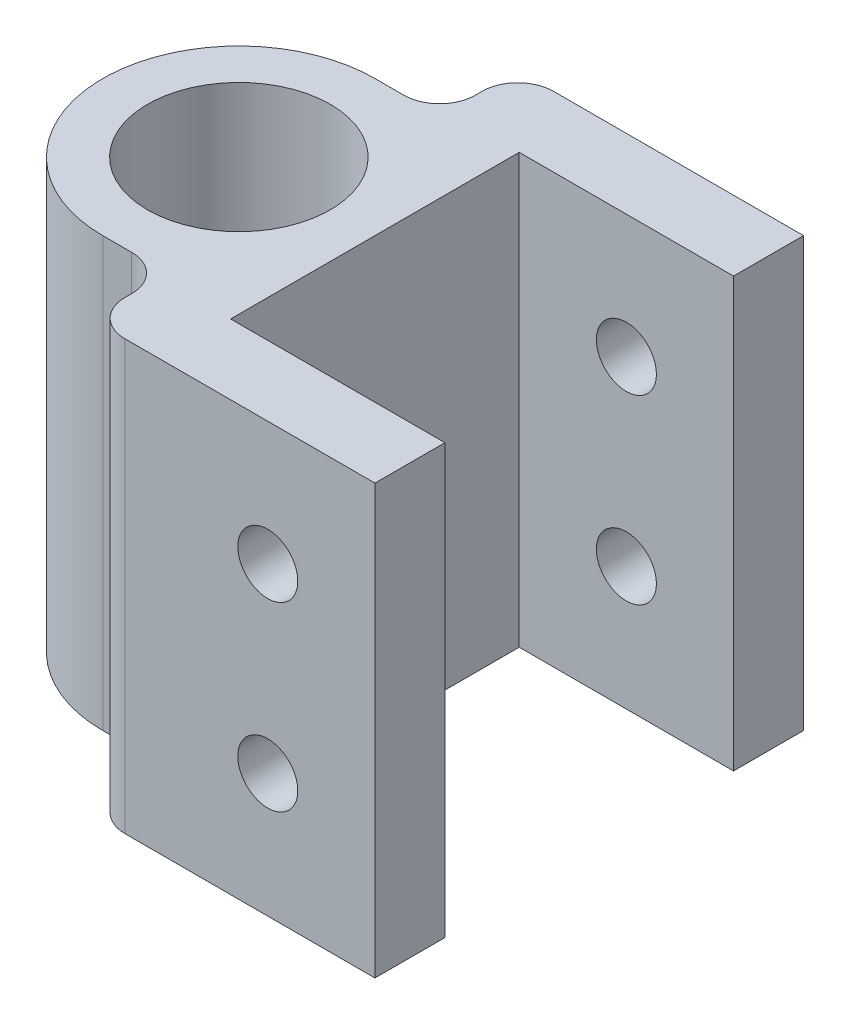
ISO-10303-21;
HEADER;
FILE_DESCRIPTION(('STEP AP214'),'2;1');
FILE_NAME('part.step','',(''),(''),'','','');
FILE_SCHEMA(('AUTOMOTIVE_DESIGN { 1 0 10303 214 1 1 1 1 }'));
ENDSEC;
DATA;
#1=APPLICATION_CONTEXT('core data for automotive mechanical design processes');
#2=APPLICATION_PROTOCOL_DEFINITION('international standard','automotive_design',2000,#1);
#3=PRODUCT_CONTEXT('',#1,'mechanical');
#4=PRODUCT('Part','Part','',(#3));
#5=PRODUCT_RELATED_PRODUCT_CATEGORY('part','',(#4));
#6=PRODUCT_DEFINITION_FORMATION('','',#4);
#7=PRODUCT_DEFINITION_CONTEXT('part definition',#1,'design');
#8=PRODUCT_DEFINITION('design','',#6,#7);
#9=PRODUCT_DEFINITION_SHAPE('','',#8);
#10=(LENGTH_UNIT() NAMED_UNIT(*) SI_UNIT(.MILLI.,.METRE.));
#11=(NAMED_UNIT(*) PLANE_ANGLE_UNIT() SI_UNIT($,.RADIAN.));
#12=(NAMED_UNIT(*) SI_UNIT($,.STERADIAN.) SOLID_ANGLE_UNIT());
#13=UNCERTAINTY_MEASURE_WITH_UNIT(LENGTH_MEASURE(1.E-05),#10,'distance_accuracy_value','');
#14=(GEOMETRIC_REPRESENTATION_CONTEXT(3) GLOBAL_UNCERTAINTY_ASSIGNED_CONTEXT((#13)) GLOBAL_UNIT_ASSIGNED_CONTEXT((#10,
#11,#12)) REPRESENTATION_CONTEXT('',''));
#15=CARTESIAN_POINT('',(0.,0.,0.));
#16=DIRECTION('',(0.,0.,1.));
#17=DIRECTION('',(1.,0.,0.));
#18=AXIS2_PLACEMENT_3D('',#15,#16,#17);
#19=CARTESIAN_POINT('',(0.,30.,0.));
#20=DIRECTION('',(0.,1.,0.));
#21=DIRECTION('',(0.,0.,1.));
#22=AXIS2_PLACEMENT_3D('',#19,#20,#21);
#23=PLANE('',#22);
#24=CARTESIAN_POINT('',(-14.712969924812,30.,-1.80451127819549));
#25=DIRECTION('',(0.,1.,0.));
#26=DIRECTION('',(0.,0.,1.));
#27=AXIS2_PLACEMENT_3D('',#24,#25,#26);
#28=CIRCLE('',#27,6.4);
#29=CARTESIAN_POINT('',(-14.712969924812,30.,4.59548872180451));
#30=VERTEX_POINT('',#29);
#31=EDGE_CURVE('E185',#30,#30,#28,.T.);
#32=ORIENTED_EDGE('',*,*,#31,.F.);
#33=EDGE_LOOP('',(#32));
#34=FACE_BOUND('',#33,.T.);
#35=DIRECTION('',(0.,0.,1.));
#36=VECTOR('',#35,1.);
#37=CARTESIAN_POINT('',(-10.187969924812,30.,0.));
#38=LINE('',#37,#36);
#39=CARTESIAN_POINT('',(-10.187969924812,30.,10.2204887218045));
#40=VERTEX_POINT('',#39);
#41=CARTESIAN_POINT('',(-10.187969924812,30.,10.6954887218045));
#42=VERTEX_POINT('',#41);
#43=EDGE_CURVE('E203',#40,#42,#38,.T.);
#44=ORIENTED_EDGE('',*,*,#43,.T.);
#45=CARTESIAN_POINT('',(-7.68796992481203,30.,10.6954887218045));
#46=DIRECTION('',(0.,1.,0.));
#47=DIRECTION('',(0.,0.,1.));
#48=AXIS2_PLACEMENT_3D('',#45,#46,#47);
#49=CIRCLE('',#48,2.5);
#50=CARTESIAN_POINT('',(-7.68796992481203,30.,13.1954887218045));
#51=VERTEX_POINT('',#50);
#52=EDGE_CURVE('E268',#42,#51,#49,.T.);
#53=ORIENTED_EDGE('',*,*,#52,.T.);
#54=DIRECTION('',(1.,0.,0.));
#55=VECTOR('',#54,1.);
#56=CARTESIAN_POINT('',(0.,30.,13.1954887218045));
#57=LINE('',#56,#55);
#58=CARTESIAN_POINT('',(9.81203007518797,30.,13.1954887218045));
#59=VERTEX_POINT('',#58);
#60=EDGE_CURVE('E206',#51,#59,#57,.T.);
#61=ORIENTED_EDGE('',*,*,#60,.T.);
#62=DIRECTION('',(0.,0.,-1.));
#63=VECTOR('',#62,1.);
#64=CARTESIAN_POINT('',(9.81203007518797,30.,0.));
#65=LINE('',#64,#63);
#66=CARTESIAN_POINT('',(9.81203007518797,30.,8.2954887218045));
#67=VERTEX_POINT('',#66);
#68=EDGE_CURVE('E208',#59,#67,#65,.T.);
#69=ORIENTED_EDGE('',*,*,#68,.T.);
#70=DIRECTION('',(1.,0.,0.));
#71=VECTOR('',#70,1.);
#72=CARTESIAN_POINT('',(0.,30.,8.2954887218045));
#73=LINE('',#72,#71);
#74=CARTESIAN_POINT('',(-5.18796992481203,30.,8.2954887218045));
#75=VERTEX_POINT('',#74);
#76=EDGE_CURVE('E210',#75,#67,#73,.T.);
#77=ORIENTED_EDGE('',*,*,#76,.F.);
#78=DIRECTION('',(0.,0.,1.));
#79=VECTOR('',#78,1.);
#80=CARTESIAN_POINT('',(-5.18796992481203,30.,0.));
#81=LINE('',#80,#79);
#82=CARTESIAN_POINT('',(-5.18796992481203,30.,-11.9045112781955));
#83=VERTEX_POINT('',#82);
#84=EDGE_CURVE('E213',#83,#75,#81,.T.);
#85=ORIENTED_EDGE('',*,*,#84,.F.);
#86=DIRECTION('',(1.,0.,0.));
#87=VECTOR('',#86,1.);
#88=CARTESIAN_POINT('',(0.,30.,-11.9045112781955));
#89=LINE('',#88,#87);
#90=CARTESIAN_POINT('',(9.81203007518797,30.,-11.9045112781955));
#91=VERTEX_POINT('',#90);
#92=EDGE_CURVE('E216',#83,#91,#89,.T.);
#93=ORIENTED_EDGE('',*,*,#92,.T.);
#94=DIRECTION('',(0.,0.,1.));
#95=VECTOR('',#94,1.);
#96=CARTESIAN_POINT('',(9.81203007518797,30.,0.));
#97=LINE('',#96,#95);
#98=CARTESIAN_POINT('',(9.81203007518797,30.,-16.8045112781955));
#99=VERTEX_POINT('',#98);
#100=EDGE_CURVE('E192',#99,#91,#97,.T.);
#101=ORIENTED_EDGE('',*,*,#100,.F.);
#102=DIRECTION('',(1.,0.,0.));
#103=VECTOR('',#102,1.);
#104=CARTESIAN_POINT('',(0.,30.,-16.8045112781955));
#105=LINE('',#104,#103);
#106=CARTESIAN_POINT('',(-7.68796992481203,30.,-16.8045112781955));
#107=VERTEX_POINT('',#106);
#108=EDGE_CURVE('E195',#107,#99,#105,.T.);
#109=ORIENTED_EDGE('',*,*,#108,.F.);
#110=CARTESIAN_POINT('',(-7.68796992481203,30.,-14.3045112781955));
#111=DIRECTION('',(0.,1.,0.));
#112=DIRECTION('',(0.,0.,1.));
#113=AXIS2_PLACEMENT_3D('',#110,#111,#112);
#114=CIRCLE('',#113,2.5);
#115=CARTESIAN_POINT('',(-10.187969924812,30.,-14.3045112781955));
#116=VERTEX_POINT('',#115);
#117=EDGE_CURVE('E266',#107,#116,#114,.T.);
#118=ORIENTED_EDGE('',*,*,#117,.T.);
#119=DIRECTION('',(0.,0.,1.));
#120=VECTOR('',#119,1.);
#121=CARTESIAN_POINT('',(-10.187969924812,30.,0.));
#122=LINE('',#121,#120);
#123=CARTESIAN_POINT('',(-10.187969924812,30.,-13.8295112781955));
#124=VERTEX_POINT('',#123);
#125=EDGE_CURVE('E198',#116,#124,#122,.T.);
#126=ORIENTED_EDGE('',*,*,#125,.T.);
#127=CARTESIAN_POINT('',(-12.687969924812,30.,-13.8295112781955));
#128=DIRECTION('',(0.,1.,0.));
#129=DIRECTION('',(0.,0.,1.));
#130=AXIS2_PLACEMENT_3D('',#127,#128,#129);
#131=CIRCLE('',#130,2.5);
#132=CARTESIAN_POINT('',(-12.687969924812,30.,-11.3295112781955));
#133=VERTEX_POINT('',#132);
#134=EDGE_CURVE('E11',#124,#133,#131,.F.);
#135=ORIENTED_EDGE('',*,*,#134,.T.);
#136=DIRECTION('',(-1.,0.,0.));
#137=VECTOR('',#136,1.);
#138=CARTESIAN_POINT('',(0.,30.,-11.3295112781955));
#139=LINE('',#138,#137);
#140=CARTESIAN_POINT('',(-14.712969924812,30.,-11.3295112781955));
#141=VERTEX_POINT('',#140);
#142=EDGE_CURVE('E200',#133,#141,#139,.T.);
#143=ORIENTED_EDGE('',*,*,#142,.T.);
#144=CARTESIAN_POINT('',(-14.712969924812,30.,-1.80451127819549));
#145=DIRECTION('',(0.,1.,0.));
#146=DIRECTION('',(0.,0.,1.));
#147=AXIS2_PLACEMENT_3D('',#144,#145,#146);
#148=CIRCLE('',#147,9.525);
#149=CARTESIAN_POINT('',(-14.712969924812,30.,7.72048872180451));
#150=VERTEX_POINT('',#149);
#151=EDGE_CURVE('E171',#141,#150,#148,.T.);
#152=ORIENTED_EDGE('',*,*,#151,.T.);
#153=DIRECTION('',(-1.,0.,0.));
#154=VECTOR('',#153,1.);
#155=CARTESIAN_POINT('',(0.,30.,7.72048872180451));
#156=LINE('',#155,#154);
#157=CARTESIAN_POINT('',(-12.687969924812,30.,7.72048872180451));
#158=VERTEX_POINT('',#157);
#159=EDGE_CURVE('E175',#158,#150,#156,.T.);
#160=ORIENTED_EDGE('',*,*,#159,.F.);
#161=CARTESIAN_POINT('',(-12.687969924812,30.,10.2204887218045));
#162=DIRECTION('',(0.,1.,0.));
#163=DIRECTION('',(0.,0.,1.));
#164=AXIS2_PLACEMENT_3D('',#161,#162,#163);
#165=CIRCLE('',#164,2.5);
#166=EDGE_CURVE('E282',#158,#40,#165,.F.);
#167=ORIENTED_EDGE('',*,*,#166,.T.);
#168=EDGE_LOOP('',(#44,#53,#61,#69,#77,#85,#93,#101,#109,#118,#126,#135,#143,#152,#160,#167));
#169=FACE_BOUND('',#168,.T.);
#170=ADVANCED_FACE('F35',(#34,#169),#23,.T.);
#171=CARTESIAN_POINT('',(0.,0.,0.));
#172=DIRECTION('',(0.,1.,0.));
#173=DIRECTION('',(0.,0.,1.));
#174=AXIS2_PLACEMENT_3D('',#171,#172,#173);
#175=PLANE('',#174);
#176=CARTESIAN_POINT('',(-14.712969924812,0.,-1.80451127819549));
#177=DIRECTION('',(0.,1.,0.));
#178=DIRECTION('',(0.,0.,1.));
#179=AXIS2_PLACEMENT_3D('',#176,#177,#178);
#180=CIRCLE('',#179,6.4);
#181=CARTESIAN_POINT('',(-14.712969924812,0.,4.59548872180451));
#182=VERTEX_POINT('',#181);
#183=EDGE_CURVE('E186',#182,#182,#180,.T.);
#184=ORIENTED_EDGE('',*,*,#183,.T.);
#185=EDGE_LOOP('',(#184));
#186=FACE_BOUND('',#185,.T.);
#187=DIRECTION('',(1.,0.,0.));
#188=VECTOR('',#187,1.);
#189=CARTESIAN_POINT('',(0.,0.,13.1954887218045));
#190=LINE('',#189,#188);
#191=CARTESIAN_POINT('',(-7.68796992481203,0.,13.1954887218045));
#192=VERTEX_POINT('',#191);
#193=CARTESIAN_POINT('',(9.81203007518797,0.,13.1954887218045));
#194=VERTEX_POINT('',#193);
#195=EDGE_CURVE('E228',#192,#194,#190,.T.);
#196=ORIENTED_EDGE('',*,*,#195,.F.);
#197=CARTESIAN_POINT('',(-7.68796992481203,0.,10.6954887218045));
#198=DIRECTION('',(0.,1.,0.));
#199=DIRECTION('',(0.,0.,1.));
#200=AXIS2_PLACEMENT_3D('',#197,#198,#199);
#201=CIRCLE('',#200,2.5);
#202=CARTESIAN_POINT('',(-10.187969924812,0.,10.6954887218045));
#203=VERTEX_POINT('',#202);
#204=EDGE_CURVE('E259',#192,#203,#201,.F.);
#205=ORIENTED_EDGE('',*,*,#204,.T.);
#206=DIRECTION('',(0.,0.,1.));
#207=VECTOR('',#206,1.);
#208=CARTESIAN_POINT('',(-10.187969924812,0.,0.));
#209=LINE('',#208,#207);
#210=CARTESIAN_POINT('',(-10.187969924812,0.,10.2204887218045));
#211=VERTEX_POINT('',#210);
#212=EDGE_CURVE('E160',#211,#203,#209,.T.);
#213=ORIENTED_EDGE('',*,*,#212,.F.);
#214=CARTESIAN_POINT('',(-12.687969924812,0.,10.2204887218045));
#215=DIRECTION('',(0.,1.,0.));
#216=DIRECTION('',(0.,0.,1.));
#217=AXIS2_PLACEMENT_3D('',#214,#215,#216);
#218=CIRCLE('',#217,2.5);
#219=CARTESIAN_POINT('',(-12.687969924812,0.,7.72048872180451));
#220=VERTEX_POINT('',#219);
#221=EDGE_CURVE('E156',#211,#220,#218,.T.);
#222=ORIENTED_EDGE('',*,*,#221,.T.);
#223=DIRECTION('',(-1.,0.,0.));
#224=VECTOR('',#223,1.);
#225=CARTESIAN_POINT('',(0.,0.,7.72048872180451));
#226=LINE('',#225,#224);
#227=CARTESIAN_POINT('',(-14.712969924812,0.,7.72048872180451));
#228=VERTEX_POINT('',#227);
#229=EDGE_CURVE('E149',#220,#228,#226,.T.);
#230=ORIENTED_EDGE('',*,*,#229,.T.);
#231=CARTESIAN_POINT('',(-14.712969924812,0.,-1.80451127819549));
#232=DIRECTION('',(0.,1.,0.));
#233=DIRECTION('',(0.,0.,1.));
#234=AXIS2_PLACEMENT_3D('',#231,#232,#233);
#235=CIRCLE('',#234,9.525);
#236=CARTESIAN_POINT('',(-14.712969924812,0.,-11.3295112781955));
#237=VERTEX_POINT('',#236);
#238=EDGE_CURVE('E154',#237,#228,#235,.T.);
#239=ORIENTED_EDGE('',*,*,#238,.F.);
#240=DIRECTION('',(-1.,0.,0.));
#241=VECTOR('',#240,1.);
#242=CARTESIAN_POINT('',(0.,0.,-11.3295112781955));
#243=LINE('',#242,#241);
#244=CARTESIAN_POINT('',(-12.687969924812,0.,-11.3295112781955));
#245=VERTEX_POINT('',#244);
#246=EDGE_CURVE('E161',#245,#237,#243,.T.);
#247=ORIENTED_EDGE('',*,*,#246,.F.);
#248=CARTESIAN_POINT('',(-12.687969924812,0.,-13.8295112781955));
#249=DIRECTION('',(0.,1.,0.));
#250=DIRECTION('',(0.,0.,1.));
#251=AXIS2_PLACEMENT_3D('',#248,#249,#250);
#252=CIRCLE('',#251,2.5);
#253=CARTESIAN_POINT('',(-10.187969924812,0.,-13.8295112781955));
#254=VERTEX_POINT('',#253);
#255=EDGE_CURVE('E44',#245,#254,#252,.T.);
#256=ORIENTED_EDGE('',*,*,#255,.T.);
#257=DIRECTION('',(0.,0.,1.));
#258=VECTOR('',#257,1.);
#259=CARTESIAN_POINT('',(-10.187969924812,0.,0.));
#260=LINE('',#259,#258);
#261=CARTESIAN_POINT('',(-10.187969924812,0.,-14.3045112781955));
#262=VERTEX_POINT('',#261);
#263=EDGE_CURVE('E223',#262,#254,#260,.T.);
#264=ORIENTED_EDGE('',*,*,#263,.F.);
#265=CARTESIAN_POINT('',(-7.68796992481203,0.,-14.3045112781955));
#266=DIRECTION('',(0.,1.,0.));
#267=DIRECTION('',(0.,0.,1.));
#268=AXIS2_PLACEMENT_3D('',#265,#266,#267);
#269=CIRCLE('',#268,2.5);
#270=CARTESIAN_POINT('',(-7.68796992481203,0.,-16.8045112781955));
#271=VERTEX_POINT('',#270);
#272=EDGE_CURVE('E257',#262,#271,#269,.F.);
#273=ORIENTED_EDGE('',*,*,#272,.T.);
#274=DIRECTION('',(1.,0.,0.));
#275=VECTOR('',#274,1.);
#276=CARTESIAN_POINT('',(0.,0.,-16.8045112781955));
#277=LINE('',#276,#275);
#278=CARTESIAN_POINT('',(9.81203007518797,0.,-16.8045112781955));
#279=VERTEX_POINT('',#278);
#280=EDGE_CURVE('E221',#271,#279,#277,.T.);
#281=ORIENTED_EDGE('',*,*,#280,.T.);
#282=DIRECTION('',(0.,0.,1.));
#283=VECTOR('',#282,1.);
#284=CARTESIAN_POINT('',(9.81203007518797,0.,0.));
#285=LINE('',#284,#283);
#286=CARTESIAN_POINT('',(9.81203007518797,0.,-11.9045112781955));
#287=VERTEX_POINT('',#286);
#288=EDGE_CURVE('E189',#279,#287,#285,.T.);
#289=ORIENTED_EDGE('',*,*,#288,.T.);
#290=DIRECTION('',(1.,0.,0.));
#291=VECTOR('',#290,1.);
#292=CARTESIAN_POINT('',(0.,0.,-11.9045112781955));
#293=LINE('',#292,#291);
#294=CARTESIAN_POINT('',(-5.18796992481203,0.,-11.9045112781955));
#295=VERTEX_POINT('',#294);
#296=EDGE_CURVE('E196',#295,#287,#293,.T.);
#297=ORIENTED_EDGE('',*,*,#296,.F.);
#298=DIRECTION('',(0.,0.,1.));
#299=VECTOR('',#298,1.);
#300=CARTESIAN_POINT('',(-5.18796992481203,0.,0.));
#301=LINE('',#300,#299);
#302=CARTESIAN_POINT('',(-5.18796992481203,0.,8.2954887218045));
#303=VERTEX_POINT('',#302);
#304=EDGE_CURVE('E236',#295,#303,#301,.T.);
#305=ORIENTED_EDGE('',*,*,#304,.T.);
#306=DIRECTION('',(1.,0.,0.));
#307=VECTOR('',#306,1.);
#308=CARTESIAN_POINT('',(0.,0.,8.2954887218045));
#309=LINE('',#308,#307);
#310=CARTESIAN_POINT('',(9.81203007518797,0.,8.2954887218045));
#311=VERTEX_POINT('',#310);
#312=EDGE_CURVE('E233',#303,#311,#309,.T.);
#313=ORIENTED_EDGE('',*,*,#312,.T.);
#314=DIRECTION('',(0.,0.,-1.));
#315=VECTOR('',#314,1.);
#316=CARTESIAN_POINT('',(9.81203007518797,0.,0.));
#317=LINE('',#316,#315);
#318=EDGE_CURVE('E230',#194,#311,#317,.T.);
#319=ORIENTED_EDGE('',*,*,#318,.F.);
#320=EDGE_LOOP('',(#196,#205,#213,#222,#230,#239,#247,#256,#264,#273,#281,#289,#297,#305,#313,#319));
#321=FACE_BOUND('',#320,.T.);
#322=ADVANCED_FACE('F152',(#186,#321),#175,.F.);
#323=CARTESIAN_POINT('',(9.81203007518797,30.,0.));
#324=DIRECTION('',(1.,0.,0.));
#325=DIRECTION('',(0.,0.,-1.));
#326=AXIS2_PLACEMENT_3D('',#323,#324,#325);
#327=PLANE('',#326);
#328=ORIENTED_EDGE('',*,*,#288,.F.);
#329=DIRECTION('',(0.,-1.,0.));
#330=VECTOR('',#329,1.);
#331=CARTESIAN_POINT('',(9.81203007518797,30.,-16.8045112781955));
#332=LINE('',#331,#330);
#333=EDGE_CURVE('E251',#99,#279,#332,.T.);
#334=ORIENTED_EDGE('',*,*,#333,.F.);
#335=ORIENTED_EDGE('',*,*,#100,.T.);
#336=DIRECTION('',(0.,-1.,0.));
#337=VECTOR('',#336,1.);
#338=CARTESIAN_POINT('',(9.81203007518797,30.,-11.9045112781955));
#339=LINE('',#338,#337);
#340=EDGE_CURVE('E218',#91,#287,#339,.T.);
#341=ORIENTED_EDGE('',*,*,#340,.T.);
#342=EDGE_LOOP('',(#328,#334,#335,#341));
#343=FACE_BOUND('',#342,.T.);
#344=ADVANCED_FACE('F330',(#343),#327,.T.);
#345=CARTESIAN_POINT('',(0.,30.,-16.8045112781955));
#346=DIRECTION('',(0.,0.,-1.));
#347=DIRECTION('',(-1.,0.,0.));
#348=AXIS2_PLACEMENT_3D('',#345,#346,#347);
#349=PLANE('',#348);
#350=CARTESIAN_POINT('',(2.31203007518797,21.35,-16.8045112781955));
#351=DIRECTION('',(0.,0.,-1.));
#352=DIRECTION('',(-1.,0.,0.));
#353=AXIS2_PLACEMENT_3D('',#350,#351,#352);
#354=CIRCLE('',#353,2.1);
#355=CARTESIAN_POINT('',(0.212030075187972,21.35,-16.8045112781955));
#356=VERTEX_POINT('',#355);
#357=EDGE_CURVE('E413',#356,#356,#354,.T.);
#358=ORIENTED_EDGE('',*,*,#357,.F.);
#359=EDGE_LOOP('',(#358));
#360=FACE_BOUND('',#359,.T.);
#361=CARTESIAN_POINT('',(2.31203007518797,8.65,-16.8045112781955));
#362=DIRECTION('',(0.,0.,-1.));
#363=DIRECTION('',(-1.,0.,0.));
#364=AXIS2_PLACEMENT_3D('',#361,#362,#363);
#365=CIRCLE('',#364,2.1);
#366=CARTESIAN_POINT('',(0.212030075187971,8.65,-16.8045112781955));
#367=VERTEX_POINT('',#366);
#368=EDGE_CURVE('E421',#367,#367,#365,.T.);
#369=ORIENTED_EDGE('',*,*,#368,.F.);
#370=EDGE_LOOP('',(#369));
#371=FACE_BOUND('',#370,.T.);
#372=ORIENTED_EDGE('',*,*,#280,.F.);
#373=DIRECTION('',(0.,-1.,0.));
#374=VECTOR('',#373,1.);
#375=CARTESIAN_POINT('',(-7.68796992481203,30.,-16.8045112781955));
#376=LINE('',#375,#374);
#377=EDGE_CURVE('E276',#271,#107,#376,.F.);
#378=ORIENTED_EDGE('',*,*,#377,.T.);
#379=ORIENTED_EDGE('',*,*,#108,.T.);
#380=ORIENTED_EDGE('',*,*,#333,.T.);
#381=EDGE_LOOP('',(#372,#378,#379,#380));
#382=FACE_BOUND('',#381,.T.);
#383=ADVANCED_FACE('F333',(#360,#371,#382),#349,.T.);
#384=CARTESIAN_POINT('',(-10.187969924812,30.,0.));
#385=DIRECTION('',(1.,0.,0.));
#386=DIRECTION('',(0.,0.,-1.));
#387=AXIS2_PLACEMENT_3D('',#384,#385,#386);
#388=PLANE('',#387);
#389=ORIENTED_EDGE('',*,*,#125,.F.);
#390=DIRECTION('',(0.,-1.,0.));
#391=VECTOR('',#390,1.);
#392=CARTESIAN_POINT('',(-10.187969924812,0.,-14.3045112781955));
#393=LINE('',#392,#391);
#394=EDGE_CURVE('E273',#116,#262,#393,.T.);
#395=ORIENTED_EDGE('',*,*,#394,.T.);
#396=ORIENTED_EDGE('',*,*,#263,.T.);
#397=DIRECTION('',(0.,-1.,0.));
#398=VECTOR('',#397,1.);
#399=CARTESIAN_POINT('',(-10.187969924812,30.,-13.8295112781955));
#400=LINE('',#399,#398);
#401=EDGE_CURVE('E57',#254,#124,#400,.F.);
#402=ORIENTED_EDGE('',*,*,#401,.T.);
#403=EDGE_LOOP('',(#389,#395,#396,#402));
#404=FACE_BOUND('',#403,.T.);
#405=ADVANCED_FACE('F287',(#404),#388,.F.);
#406=CARTESIAN_POINT('',(0.,30.,-11.3295112781955));
#407=DIRECTION('',(0.,0.,1.));
#408=DIRECTION('',(1.,0.,0.));
#409=AXIS2_PLACEMENT_3D('',#406,#407,#408);
#410=PLANE('',#409);
#411=ORIENTED_EDGE('',*,*,#142,.F.);
#412=DIRECTION('',(0.,-1.,0.));
#413=VECTOR('',#412,1.);
#414=CARTESIAN_POINT('',(-12.687969924812,0.,-11.3295112781955));
#415=LINE('',#414,#413);
#416=EDGE_CURVE('E278',#133,#245,#415,.T.);
#417=ORIENTED_EDGE('',*,*,#416,.T.);
#418=ORIENTED_EDGE('',*,*,#246,.T.);
#419=DIRECTION('',(0.,1.,0.));
#420=VECTOR('',#419,1.);
#421=CARTESIAN_POINT('',(-14.712969924812,0.,-11.3295112781955));
#422=LINE('',#421,#420);
#423=EDGE_CURVE('E170',#237,#141,#422,.T.);
#424=ORIENTED_EDGE('',*,*,#423,.T.);
#425=EDGE_LOOP('',(#411,#417,#418,#424));
#426=FACE_BOUND('',#425,.T.);
#427=ADVANCED_FACE('F290',(#426),#410,.F.);
#428=CARTESIAN_POINT('',(0.,30.,7.72048872180451));
#429=DIRECTION('',(0.,0.,1.));
#430=DIRECTION('',(1.,0.,0.));
#431=AXIS2_PLACEMENT_3D('',#428,#429,#430);
#432=PLANE('',#431);
#433=ORIENTED_EDGE('',*,*,#229,.F.);
#434=DIRECTION('',(0.,-1.,0.));
#435=VECTOR('',#434,1.);
#436=CARTESIAN_POINT('',(-12.687969924812,30.,7.72048872180451));
#437=LINE('',#436,#435);
#438=EDGE_CURVE('E270',#220,#158,#437,.F.);
#439=ORIENTED_EDGE('',*,*,#438,.T.);
#440=ORIENTED_EDGE('',*,*,#159,.T.);
#441=DIRECTION('',(0.,1.,0.));
#442=VECTOR('',#441,1.);
#443=CARTESIAN_POINT('',(-14.712969924812,0.,7.72048872180451));
#444=LINE('',#443,#442);
#445=EDGE_CURVE('E168',#228,#150,#444,.T.);
#446=ORIENTED_EDGE('',*,*,#445,.F.);
#447=EDGE_LOOP('',(#433,#439,#440,#446));
#448=FACE_BOUND('',#447,.T.);
#449=ADVANCED_FACE('F173',(#448),#432,.T.);
#450=CARTESIAN_POINT('',(-10.187969924812,30.,0.));
#451=DIRECTION('',(1.,0.,0.));
#452=DIRECTION('',(0.,0.,-1.));
#453=AXIS2_PLACEMENT_3D('',#450,#451,#452);
#454=PLANE('',#453);
#455=ORIENTED_EDGE('',*,*,#212,.T.);
#456=DIRECTION('',(0.,-1.,0.));
#457=VECTOR('',#456,1.);
#458=CARTESIAN_POINT('',(-10.187969924812,30.,10.6954887218045));
#459=LINE('',#458,#457);
#460=EDGE_CURVE('E264',#203,#42,#459,.F.);
#461=ORIENTED_EDGE('',*,*,#460,.T.);
#462=ORIENTED_EDGE('',*,*,#43,.F.);
#463=DIRECTION('',(0.,-1.,0.));
#464=VECTOR('',#463,1.);
#465=CARTESIAN_POINT('',(-10.187969924812,30.,10.2204887218045));
#466=LINE('',#465,#464);
#467=EDGE_CURVE('E261',#40,#211,#466,.T.);
#468=ORIENTED_EDGE('',*,*,#467,.T.);
#469=EDGE_LOOP('',(#455,#461,#462,#468));
#470=FACE_BOUND('',#469,.T.);
#471=ADVANCED_FACE('F297',(#470),#454,.F.);
#472=CARTESIAN_POINT('',(0.,30.,13.1954887218045));
#473=DIRECTION('',(0.,0.,-1.));
#474=DIRECTION('',(-1.,0.,0.));
#475=AXIS2_PLACEMENT_3D('',#472,#473,#474);
#476=PLANE('',#475);
#477=CARTESIAN_POINT('',(2.31203007518797,21.35,13.1954887218045));
#478=DIRECTION('',(0.,0.,-1.));
#479=DIRECTION('',(-1.,0.,0.));
#480=AXIS2_PLACEMENT_3D('',#477,#478,#479);
#481=CIRCLE('',#480,2.09999999999999);
#482=CARTESIAN_POINT('',(0.212030075187975,21.35,13.1954887218045));
#483=VERTEX_POINT('',#482);
#484=EDGE_CURVE('E411',#483,#483,#481,.T.);
#485=ORIENTED_EDGE('',*,*,#484,.T.);
#486=EDGE_LOOP('',(#485));
#487=FACE_BOUND('',#486,.T.);
#488=CARTESIAN_POINT('',(2.31203007518797,8.65,13.1954887218045));
#489=DIRECTION('',(0.,0.,-1.));
#490=DIRECTION('',(-1.,0.,0.));
#491=AXIS2_PLACEMENT_3D('',#488,#489,#490);
#492=CIRCLE('',#491,2.09999999999999);
#493=CARTESIAN_POINT('',(0.212030075187975,8.65,13.1954887218045));
#494=VERTEX_POINT('',#493);
#495=EDGE_CURVE('E423',#494,#494,#492,.T.);
#496=ORIENTED_EDGE('',*,*,#495,.T.);
#497=EDGE_LOOP('',(#496));
#498=FACE_BOUND('',#497,.T.);
#499=ORIENTED_EDGE('',*,*,#60,.F.);
#500=DIRECTION('',(0.,-1.,0.));
#501=VECTOR('',#500,1.);
#502=CARTESIAN_POINT('',(-7.68796992481203,30.,13.1954887218045));
#503=LINE('',#502,#501);
#504=EDGE_CURVE('E254',#51,#192,#503,.T.);
#505=ORIENTED_EDGE('',*,*,#504,.T.);
#506=ORIENTED_EDGE('',*,*,#195,.T.);
#507=DIRECTION('',(0.,-1.,0.));
#508=VECTOR('',#507,1.);
#509=CARTESIAN_POINT('',(9.81203007518797,30.,13.1954887218045));
#510=LINE('',#509,#508);
#511=EDGE_CURVE('E248',#59,#194,#510,.T.);
#512=ORIENTED_EDGE('',*,*,#511,.F.);
#513=EDGE_LOOP('',(#499,#505,#506,#512));
#514=FACE_BOUND('',#513,.T.);
#515=ADVANCED_FACE('F306',(#487,#498,#514),#476,.F.);
#516=CARTESIAN_POINT('',(9.81203007518797,30.,0.));
#517=DIRECTION('',(-1.,0.,0.));
#518=DIRECTION('',(0.,0.,1.));
#519=AXIS2_PLACEMENT_3D('',#516,#517,#518);
#520=PLANE('',#519);
#521=ORIENTED_EDGE('',*,*,#318,.T.);
#522=DIRECTION('',(0.,-1.,0.));
#523=VECTOR('',#522,1.);
#524=CARTESIAN_POINT('',(9.81203007518797,30.,8.2954887218045));
#525=LINE('',#524,#523);
#526=EDGE_CURVE('E246',#67,#311,#525,.T.);
#527=ORIENTED_EDGE('',*,*,#526,.F.);
#528=ORIENTED_EDGE('',*,*,#68,.F.);
#529=ORIENTED_EDGE('',*,*,#511,.T.);
#530=EDGE_LOOP('',(#521,#527,#528,#529));
#531=FACE_BOUND('',#530,.T.);
#532=ADVANCED_FACE('F313',(#531),#520,.F.);
#533=CARTESIAN_POINT('',(0.,30.,8.2954887218045));
#534=DIRECTION('',(0.,0.,-1.));
#535=DIRECTION('',(-1.,0.,0.));
#536=AXIS2_PLACEMENT_3D('',#533,#534,#535);
#537=PLANE('',#536);
#538=CARTESIAN_POINT('',(2.31203007518797,21.35,8.2954887218045));
#539=DIRECTION('',(0.,0.,-1.));
#540=DIRECTION('',(-1.,0.,0.));
#541=AXIS2_PLACEMENT_3D('',#538,#539,#540);
#542=CIRCLE('',#541,2.1);
#543=CARTESIAN_POINT('',(0.212030075187973,21.35,8.2954887218045));
#544=VERTEX_POINT('',#543);
#545=EDGE_CURVE('E408',#544,#544,#542,.T.);
#546=ORIENTED_EDGE('',*,*,#545,.F.);
#547=EDGE_LOOP('',(#546));
#548=FACE_BOUND('',#547,.T.);
#549=CARTESIAN_POINT('',(2.31203007518797,8.65,8.2954887218045));
#550=DIRECTION('',(0.,0.,-1.));
#551=DIRECTION('',(-1.,0.,0.));
#552=AXIS2_PLACEMENT_3D('',#549,#550,#551);
#553=CIRCLE('',#552,2.1);
#554=CARTESIAN_POINT('',(0.212030075187973,8.65,8.2954887218045));
#555=VERTEX_POINT('',#554);
#556=EDGE_CURVE('E39',#555,#555,#553,.T.);
#557=ORIENTED_EDGE('',*,*,#556,.F.);
#558=EDGE_LOOP('',(#557));
#559=FACE_BOUND('',#558,.T.);
#560=ORIENTED_EDGE('',*,*,#312,.F.);
#561=DIRECTION('',(0.,-1.,0.));
#562=VECTOR('',#561,1.);
#563=CARTESIAN_POINT('',(-5.18796992481203,30.,8.2954887218045));
#564=LINE('',#563,#562);
#565=EDGE_CURVE('E244',#75,#303,#564,.T.);
#566=ORIENTED_EDGE('',*,*,#565,.F.);
#567=ORIENTED_EDGE('',*,*,#76,.T.);
#568=ORIENTED_EDGE('',*,*,#526,.T.);
#569=EDGE_LOOP('',(#560,#566,#567,#568));
#570=FACE_BOUND('',#569,.T.);
#571=ADVANCED_FACE('F316',(#548,#559,#570),#537,.T.);
#572=CARTESIAN_POINT('',(-5.18796992481203,30.,0.));
#573=DIRECTION('',(1.,0.,0.));
#574=DIRECTION('',(0.,0.,-1.));
#575=AXIS2_PLACEMENT_3D('',#572,#573,#574);
#576=PLANE('',#575);
#577=ORIENTED_EDGE('',*,*,#304,.F.);
#578=DIRECTION('',(0.,-1.,0.));
#579=VECTOR('',#578,1.);
#580=CARTESIAN_POINT('',(-5.18796992481203,30.,-11.9045112781955));
#581=LINE('',#580,#579);
#582=EDGE_CURVE('E242',#83,#295,#581,.T.);
#583=ORIENTED_EDGE('',*,*,#582,.F.);
#584=ORIENTED_EDGE('',*,*,#84,.T.);
#585=ORIENTED_EDGE('',*,*,#565,.T.);
#586=EDGE_LOOP('',(#577,#583,#584,#585));
#587=FACE_BOUND('',#586,.T.);
#588=ADVANCED_FACE('F319',(#587),#576,.T.);
#589=CARTESIAN_POINT('',(0.,30.,-11.9045112781955));
#590=DIRECTION('',(0.,0.,-1.));
#591=DIRECTION('',(-1.,0.,0.));
#592=AXIS2_PLACEMENT_3D('',#589,#590,#591);
#593=PLANE('',#592);
#594=CARTESIAN_POINT('',(2.31203007518797,21.35,-11.9045112781955));
#595=DIRECTION('',(0.,0.,-1.));
#596=DIRECTION('',(-1.,0.,0.));
#597=AXIS2_PLACEMENT_3D('',#594,#595,#596);
#598=CIRCLE('',#597,2.1);
#599=CARTESIAN_POINT('',(0.212030075187973,21.35,-11.9045112781955));
#600=VERTEX_POINT('',#599);
#601=EDGE_CURVE('E412',#600,#600,#598,.T.);
#602=ORIENTED_EDGE('',*,*,#601,.T.);
#603=EDGE_LOOP('',(#602));
#604=FACE_BOUND('',#603,.T.);
#605=CARTESIAN_POINT('',(2.31203007518797,8.65,-11.9045112781955));
#606=DIRECTION('',(0.,0.,-1.));
#607=DIRECTION('',(-1.,0.,0.));
#608=AXIS2_PLACEMENT_3D('',#605,#606,#607);
#609=CIRCLE('',#608,2.1);
#610=CARTESIAN_POINT('',(0.212030075187973,8.65,-11.9045112781955));
#611=VERTEX_POINT('',#610);
#612=EDGE_CURVE('E177',#611,#611,#609,.T.);
#613=ORIENTED_EDGE('',*,*,#612,.T.);
#614=EDGE_LOOP('',(#613));
#615=FACE_BOUND('',#614,.T.);
#616=ORIENTED_EDGE('',*,*,#296,.T.);
#617=ORIENTED_EDGE('',*,*,#340,.F.);
#618=ORIENTED_EDGE('',*,*,#92,.F.);
#619=ORIENTED_EDGE('',*,*,#582,.T.);
#620=EDGE_LOOP('',(#616,#617,#618,#619));
#621=FACE_BOUND('',#620,.T.);
#622=ADVANCED_FACE('F325',(#604,#615,#621),#593,.F.);
#623=CARTESIAN_POINT('',(-14.712969924812,0.,-1.80451127819549));
#624=DIRECTION('',(0.,1.,0.));
#625=DIRECTION('',(0.,0.,1.));
#626=AXIS2_PLACEMENT_3D('',#623,#624,#625);
#627=CYLINDRICAL_SURFACE('',#626,6.4);
#628=ORIENTED_EDGE('',*,*,#183,.F.);
#629=EDGE_LOOP('',(#628));
#630=FACE_BOUND('',#629,.T.);
#631=ORIENTED_EDGE('',*,*,#31,.T.);
#632=EDGE_LOOP('',(#631));
#633=FACE_BOUND('',#632,.T.);
#634=ADVANCED_FACE('F355',(#630,#633),#627,.F.);
#635=CARTESIAN_POINT('',(-14.712969924812,0.,-1.80451127819549));
#636=DIRECTION('',(0.,1.,0.));
#637=DIRECTION('',(0.,0.,1.));
#638=AXIS2_PLACEMENT_3D('',#635,#636,#637);
#639=CYLINDRICAL_SURFACE('',#638,9.525);
#640=ORIENTED_EDGE('',*,*,#151,.F.);
#641=ORIENTED_EDGE('',*,*,#423,.F.);
#642=ORIENTED_EDGE('',*,*,#238,.T.);
#643=ORIENTED_EDGE('',*,*,#445,.T.);
#644=EDGE_LOOP('',(#640,#641,#642,#643));
#645=FACE_BOUND('',#644,.T.);
#646=ADVANCED_FACE('F167',(#645),#639,.T.);
#647=CARTESIAN_POINT('',(-7.68796992481203,30.,10.6954887218045));
#648=DIRECTION('',(0.,-1.,0.));
#649=DIRECTION('',(0.,0.,-1.));
#650=AXIS2_PLACEMENT_3D('',#647,#648,#649);
#651=CYLINDRICAL_SURFACE('',#650,2.5);
#652=ORIENTED_EDGE('',*,*,#52,.F.);
#653=ORIENTED_EDGE('',*,*,#460,.F.);
#654=ORIENTED_EDGE('',*,*,#204,.F.);
#655=ORIENTED_EDGE('',*,*,#504,.F.);
#656=EDGE_LOOP('',(#652,#653,#654,#655));
#657=FACE_BOUND('',#656,.T.);
#658=ADVANCED_FACE('F303',(#657),#651,.T.);
#659=CARTESIAN_POINT('',(-12.687969924812,30.,10.2204887218045));
#660=DIRECTION('',(0.,-1.,0.));
#661=DIRECTION('',(0.,0.,-1.));
#662=AXIS2_PLACEMENT_3D('',#659,#660,#661);
#663=CYLINDRICAL_SURFACE('',#662,2.5);
#664=ORIENTED_EDGE('',*,*,#166,.F.);
#665=ORIENTED_EDGE('',*,*,#438,.F.);
#666=ORIENTED_EDGE('',*,*,#221,.F.);
#667=ORIENTED_EDGE('',*,*,#467,.F.);
#668=EDGE_LOOP('',(#664,#665,#666,#667));
#669=FACE_BOUND('',#668,.T.);
#670=ADVANCED_FACE('F295',(#669),#663,.F.);
#671=CARTESIAN_POINT('',(-7.68796992481203,30.,-14.3045112781955));
#672=DIRECTION('',(0.,1.,0.));
#673=DIRECTION('',(0.,0.,1.));
#674=AXIS2_PLACEMENT_3D('',#671,#672,#673);
#675=CYLINDRICAL_SURFACE('',#674,2.5);
#676=ORIENTED_EDGE('',*,*,#117,.F.);
#677=ORIENTED_EDGE('',*,*,#377,.F.);
#678=ORIENTED_EDGE('',*,*,#272,.F.);
#679=ORIENTED_EDGE('',*,*,#394,.F.);
#680=EDGE_LOOP('',(#676,#677,#678,#679));
#681=FACE_BOUND('',#680,.T.);
#682=ADVANCED_FACE('F337',(#681),#675,.T.);
#683=CARTESIAN_POINT('',(-12.687969924812,30.,-13.8295112781955));
#684=DIRECTION('',(0.,1.,0.));
#685=DIRECTION('',(0.,0.,1.));
#686=AXIS2_PLACEMENT_3D('',#683,#684,#685);
#687=CYLINDRICAL_SURFACE('',#686,2.5);
#688=ORIENTED_EDGE('',*,*,#134,.F.);
#689=ORIENTED_EDGE('',*,*,#401,.F.);
#690=ORIENTED_EDGE('',*,*,#255,.F.);
#691=ORIENTED_EDGE('',*,*,#416,.F.);
#692=EDGE_LOOP('',(#688,#689,#690,#691));
#693=FACE_BOUND('',#692,.T.);
#694=ADVANCED_FACE('F37',(#693),#687,.F.);
#695=CARTESIAN_POINT('',(2.31203007518797,8.65,-16.8045112781955));
#696=DIRECTION('',(0.,0.,-1.));
#697=DIRECTION('',(-1.,0.,0.));
#698=AXIS2_PLACEMENT_3D('',#695,#696,#697);
#699=CYLINDRICAL_SURFACE('',#698,2.1);
#700=ORIENTED_EDGE('',*,*,#556,.T.);
#701=EDGE_LOOP('',(#700));
#702=FACE_BOUND('',#701,.T.);
#703=ORIENTED_EDGE('',*,*,#495,.F.);
#704=EDGE_LOOP('',(#703));
#705=FACE_BOUND('',#704,.T.);
#706=ADVANCED_FACE('F343',(#702,#705),#699,.F.);
#707=ORIENTED_EDGE('',*,*,#368,.T.);
#708=EDGE_LOOP('',(#707));
#709=FACE_BOUND('',#708,.T.);
#710=ORIENTED_EDGE('',*,*,#612,.F.);
#711=EDGE_LOOP('',(#710));
#712=FACE_BOUND('',#711,.T.);
#713=ADVANCED_FACE('F395',(#709,#712),#699,.F.);
#714=CARTESIAN_POINT('',(2.31203007518797,21.35,-16.8045112781955));
#715=DIRECTION('',(0.,0.,-1.));
#716=DIRECTION('',(-1.,0.,0.));
#717=AXIS2_PLACEMENT_3D('',#714,#715,#716);
#718=CYLINDRICAL_SURFACE('',#717,2.1);
#719=ORIENTED_EDGE('',*,*,#357,.T.);
#720=EDGE_LOOP('',(#719));
#721=FACE_BOUND('',#720,.T.);
#722=ORIENTED_EDGE('',*,*,#601,.F.);
#723=EDGE_LOOP('',(#722));
#724=FACE_BOUND('',#723,.T.);
#725=ADVANCED_FACE('F399',(#721,#724),#718,.F.);
#726=ORIENTED_EDGE('',*,*,#545,.T.);
#727=EDGE_LOOP('',(#726));
#728=FACE_BOUND('',#727,.T.);
#729=ORIENTED_EDGE('',*,*,#484,.F.);
#730=EDGE_LOOP('',(#729));
#731=FACE_BOUND('',#730,.T.);
#732=ADVANCED_FACE('F397',(#728,#731),#718,.F.);
#733=CLOSED_SHELL('',(#170,#322,#344,#383,#405,#427,#449,#471,#515,#532,#571,#588,#622,#634,
#646,#658,#670,#682,#694,#706,#713,#725,#732));
#734=MANIFOLD_SOLID_BREP('B2',#733);
#735=ADVANCED_BREP_SHAPE_REPRESENTATION('',(#18,#734),#14);
#736=SHAPE_DEFINITION_REPRESENTATION(#9,#735);
ENDSEC;
END-ISO-10303-21;
